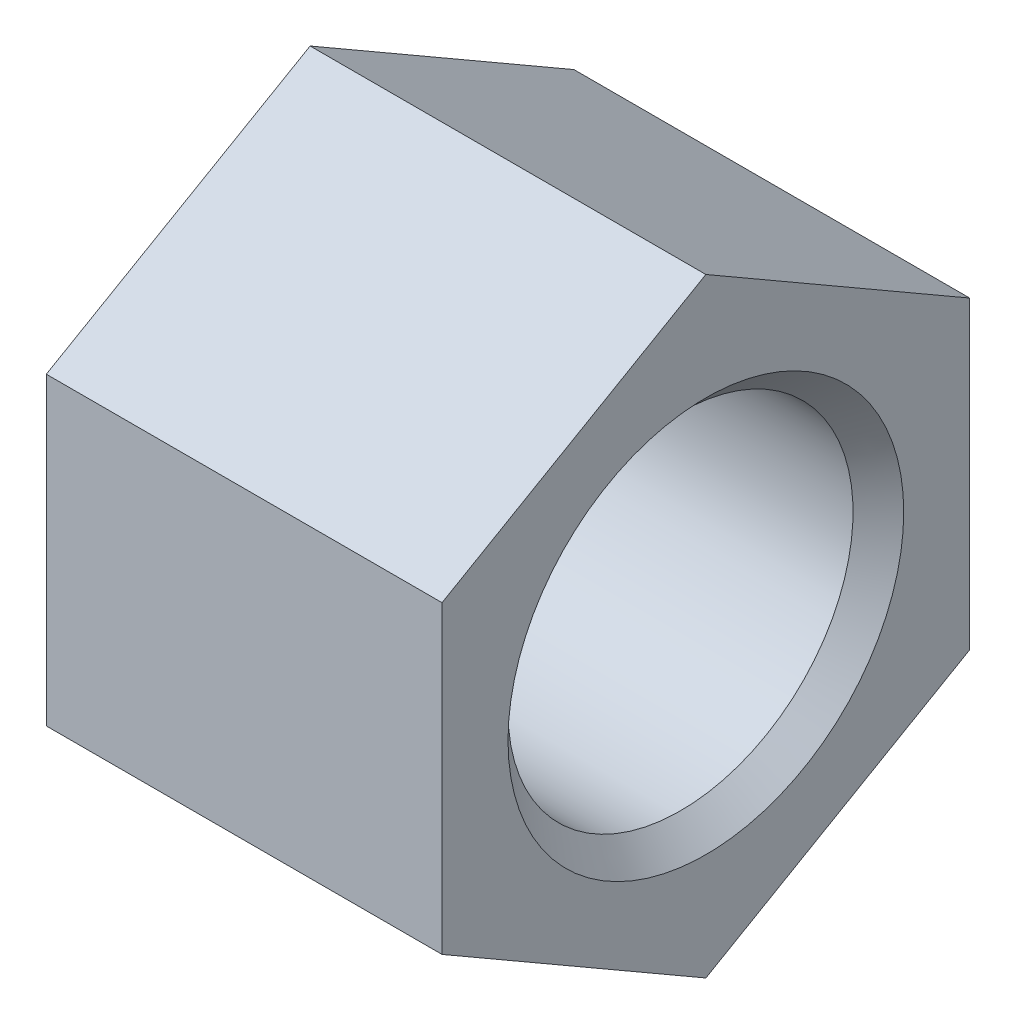
ISO-10303-21;
HEADER;
FILE_DESCRIPTION(('STEP AP214'),'2;1');
FILE_NAME('part.step','',(''),(''),'','','');
FILE_SCHEMA(('AUTOMOTIVE_DESIGN { 1 0 10303 214 1 1 1 1 }'));
ENDSEC;
DATA;
#1=APPLICATION_CONTEXT('core data for automotive mechanical design processes');
#2=APPLICATION_PROTOCOL_DEFINITION('international standard','automotive_design',2000,#1);
#3=PRODUCT_CONTEXT('',#1,'mechanical');
#4=PRODUCT('Part','Part','',(#3));
#5=PRODUCT_RELATED_PRODUCT_CATEGORY('part','',(#4));
#6=PRODUCT_DEFINITION_FORMATION('','',#4);
#7=PRODUCT_DEFINITION_CONTEXT('part definition',#1,'design');
#8=PRODUCT_DEFINITION('design','',#6,#7);
#9=PRODUCT_DEFINITION_SHAPE('','',#8);
#10=(LENGTH_UNIT() NAMED_UNIT(*) SI_UNIT(.MILLI.,.METRE.));
#11=(NAMED_UNIT(*) PLANE_ANGLE_UNIT() SI_UNIT($,.RADIAN.));
#12=(NAMED_UNIT(*) SI_UNIT($,.STERADIAN.) SOLID_ANGLE_UNIT());
#13=UNCERTAINTY_MEASURE_WITH_UNIT(LENGTH_MEASURE(1.E-05),#10,'distance_accuracy_value','');
#14=(GEOMETRIC_REPRESENTATION_CONTEXT(3) GLOBAL_UNCERTAINTY_ASSIGNED_CONTEXT((#13)) GLOBAL_UNIT_ASSIGNED_CONTEXT((#10,
#11,#12)) REPRESENTATION_CONTEXT('',''));
#15=CARTESIAN_POINT('',(0.,0.,0.));
#16=DIRECTION('',(0.,0.,1.));
#17=DIRECTION('',(1.,0.,0.));
#18=AXIS2_PLACEMENT_3D('',#15,#16,#17);
#19=CARTESIAN_POINT('',(0.,19.5,0.));
#20=DIRECTION('',(1.,0.,0.));
#21=DIRECTION('',(0.,0.,-1.));
#22=AXIS2_PLACEMENT_3D('',#19,#20,#21);
#23=PLANE('',#22);
#24=CARTESIAN_POINT('',(0.,0.,0.));
#25=DIRECTION('',(-1.,0.,0.));
#26=DIRECTION('',(0.,0.,1.));
#27=AXIS2_PLACEMENT_3D('',#24,#25,#26);
#28=CIRCLE('',#27,6.5);
#29=CARTESIAN_POINT('',(0.,0.,6.5));
#30=VERTEX_POINT('',#29);
#31=EDGE_CURVE('E156',#30,#30,#28,.T.);
#32=ORIENTED_EDGE('',*,*,#31,.F.);
#33=EDGE_LOOP('',(#32));
#34=FACE_BOUND('',#33,.T.);
#35=DIRECTION('',(0.,-0.5,-0.866025403784439));
#36=VECTOR('',#35,1.);
#37=CARTESIAN_POINT('',(0.,11.5470053837925,-20.));
#38=LINE('',#37,#36);
#39=CARTESIAN_POINT('',(0.,23.094010767585,0.));
#40=VERTEX_POINT('',#39);
#41=CARTESIAN_POINT('',(0.,11.5470053837925,-20.));
#42=VERTEX_POINT('',#41);
#43=EDGE_CURVE('E104',#40,#42,#38,.T.);
#44=ORIENTED_EDGE('',*,*,#43,.T.);
#45=DIRECTION('',(0.,-1.,0.));
#46=VECTOR('',#45,1.);
#47=CARTESIAN_POINT('',(0.,-11.5470053837925,-20.));
#48=LINE('',#47,#46);
#49=CARTESIAN_POINT('',(0.,-11.5470053837925,-20.));
#50=VERTEX_POINT('',#49);
#51=EDGE_CURVE('E218',#42,#50,#48,.T.);
#52=ORIENTED_EDGE('',*,*,#51,.T.);
#53=DIRECTION('',(0.,-0.5,0.866025403784439));
#54=VECTOR('',#53,1.);
#55=CARTESIAN_POINT('',(0.,-23.094010767585,0.));
#56=LINE('',#55,#54);
#57=CARTESIAN_POINT('',(0.,-23.094010767585,0.));
#58=VERTEX_POINT('',#57);
#59=EDGE_CURVE('E220',#50,#58,#56,.T.);
#60=ORIENTED_EDGE('',*,*,#59,.T.);
#61=DIRECTION('',(0.,0.5,0.866025403784439));
#62=VECTOR('',#61,1.);
#63=CARTESIAN_POINT('',(0.,-11.5470053837925,20.));
#64=LINE('',#63,#62);
#65=CARTESIAN_POINT('',(0.,-11.5470053837925,20.));
#66=VERTEX_POINT('',#65);
#67=EDGE_CURVE('E64',#58,#66,#64,.T.);
#68=ORIENTED_EDGE('',*,*,#67,.T.);
#69=DIRECTION('',(0.,1.,0.));
#70=VECTOR('',#69,1.);
#71=CARTESIAN_POINT('',(0.,11.5470053837925,20.));
#72=LINE('',#71,#70);
#73=CARTESIAN_POINT('',(0.,11.5470053837925,20.));
#74=VERTEX_POINT('',#73);
#75=EDGE_CURVE('E135',#66,#74,#72,.T.);
#76=ORIENTED_EDGE('',*,*,#75,.T.);
#77=DIRECTION('',(0.,0.5,-0.866025403784439));
#78=VECTOR('',#77,1.);
#79=CARTESIAN_POINT('',(0.,23.094010767585,0.));
#80=LINE('',#79,#78);
#81=EDGE_CURVE('E147',#74,#40,#80,.T.);
#82=ORIENTED_EDGE('',*,*,#81,.T.);
#83=EDGE_LOOP('',(#44,#52,#60,#68,#76,#82));
#84=FACE_BOUND('',#83,.T.);
#85=ADVANCED_FACE('F48',(#34,#84),#23,.F.);
#86=CARTESIAN_POINT('',(0.,0.,0.));
#87=DIRECTION('',(-1.,0.,0.));
#88=DIRECTION('',(0.,0.,1.));
#89=AXIS2_PLACEMENT_3D('',#86,#87,#88);
#90=CYLINDRICAL_SURFACE('',#89,6.5);
#91=CARTESIAN_POINT('',(5.,0.,0.));
#92=DIRECTION('',(-1.,0.,0.));
#93=DIRECTION('',(0.,0.,1.));
#94=AXIS2_PLACEMENT_3D('',#91,#92,#93);
#95=CIRCLE('',#94,6.5);
#96=CARTESIAN_POINT('',(5.,0.,6.5));
#97=VERTEX_POINT('',#96);
#98=EDGE_CURVE('E153',#97,#97,#95,.T.);
#99=ORIENTED_EDGE('',*,*,#98,.F.);
#100=EDGE_LOOP('',(#99));
#101=FACE_BOUND('',#100,.T.);
#102=ORIENTED_EDGE('',*,*,#31,.T.);
#103=EDGE_LOOP('',(#102));
#104=FACE_BOUND('',#103,.T.);
#105=ADVANCED_FACE('F174',(#101,#104),#90,.F.);
#106=CARTESIAN_POINT('',(5.,6.49999999999999,0.));
#107=DIRECTION('',(-1.,0.,0.));
#108=DIRECTION('',(0.,0.,1.));
#109=AXIS2_PLACEMENT_3D('',#106,#107,#108);
#110=PLANE('',#109);
#111=CARTESIAN_POINT('',(5.,0.,0.));
#112=DIRECTION('',(-1.,0.,0.));
#113=DIRECTION('',(0.,0.,1.));
#114=AXIS2_PLACEMENT_3D('',#111,#112,#113);
#115=CIRCLE('',#114,15.);
#116=CARTESIAN_POINT('',(5.,0.,15.));
#117=VERTEX_POINT('',#116);
#118=EDGE_CURVE('E150',#117,#117,#115,.T.);
#119=ORIENTED_EDGE('',*,*,#118,.F.);
#120=EDGE_LOOP('',(#119));
#121=FACE_BOUND('',#120,.T.);
#122=ORIENTED_EDGE('',*,*,#98,.T.);
#123=EDGE_LOOP('',(#122));
#124=FACE_BOUND('',#123,.T.);
#125=ADVANCED_FACE('F179',(#121,#124),#110,.F.);
#126=CARTESIAN_POINT('',(0.,0.,0.));
#127=DIRECTION('',(-1.,0.,0.));
#128=DIRECTION('',(0.,0.,1.));
#129=AXIS2_PLACEMENT_3D('',#126,#127,#128);
#130=CYLINDRICAL_SURFACE('',#129,15.);
#131=CARTESIAN_POINT('',(9.99999999999999,0.,0.));
#132=DIRECTION('',(-1.,0.,0.));
#133=DIRECTION('',(0.,0.,1.));
#134=AXIS2_PLACEMENT_3D('',#131,#132,#133);
#135=CIRCLE('',#134,15.);
#136=CARTESIAN_POINT('',(9.99999999999999,0.,15.));
#137=VERTEX_POINT('',#136);
#138=EDGE_CURVE('E146',#137,#137,#135,.T.);
#139=ORIENTED_EDGE('',*,*,#138,.F.);
#140=EDGE_LOOP('',(#139));
#141=FACE_BOUND('',#140,.T.);
#142=ORIENTED_EDGE('',*,*,#118,.T.);
#143=EDGE_LOOP('',(#142));
#144=FACE_BOUND('',#143,.T.);
#145=ADVANCED_FACE('F186',(#141,#144),#130,.F.);
#146=CARTESIAN_POINT('',(9.99999999999999,15.,0.));
#147=DIRECTION('',(1.,0.,0.));
#148=DIRECTION('',(0.,0.,-1.));
#149=AXIS2_PLACEMENT_3D('',#146,#147,#148);
#150=PLANE('',#149);
#151=CARTESIAN_POINT('',(9.99999999999999,0.,0.));
#152=DIRECTION('',(-1.,0.,0.));
#153=DIRECTION('',(0.,0.,1.));
#154=AXIS2_PLACEMENT_3D('',#151,#152,#153);
#155=CIRCLE('',#154,13.079);
#156=CARTESIAN_POINT('',(9.99999999999999,0.,13.079));
#157=VERTEX_POINT('',#156);
#158=EDGE_CURVE('E143',#157,#157,#155,.T.);
#159=ORIENTED_EDGE('',*,*,#158,.F.);
#160=EDGE_LOOP('',(#159));
#161=FACE_BOUND('',#160,.T.);
#162=ORIENTED_EDGE('',*,*,#138,.T.);
#163=EDGE_LOOP('',(#162));
#164=FACE_BOUND('',#163,.T.);
#165=ADVANCED_FACE('F190',(#161,#164),#150,.F.);
#166=CARTESIAN_POINT('',(0.,0.,0.));
#167=DIRECTION('',(-1.,0.,0.));
#168=DIRECTION('',(0.,0.,1.));
#169=AXIS2_PLACEMENT_3D('',#166,#167,#168);
#170=CYLINDRICAL_SURFACE('',#169,13.079);
#171=CARTESIAN_POINT('',(28.079,0.,0.));
#172=DIRECTION('',(-1.,0.,0.));
#173=DIRECTION('',(0.,0.,1.));
#174=AXIS2_PLACEMENT_3D('',#171,#172,#173);
#175=CIRCLE('',#174,13.079);
#176=CARTESIAN_POINT('',(28.079,0.,13.079));
#177=VERTEX_POINT('',#176);
#178=EDGE_CURVE('E13',#177,#177,#175,.F.);
#179=ORIENTED_EDGE('',*,*,#178,.T.);
#180=EDGE_LOOP('',(#179));
#181=FACE_BOUND('',#180,.T.);
#182=ORIENTED_EDGE('',*,*,#158,.T.);
#183=EDGE_LOOP('',(#182));
#184=FACE_BOUND('',#183,.T.);
#185=ADVANCED_FACE('F170',(#181,#184),#170,.F.);
#186=CARTESIAN_POINT('',(30.0000000000003,13.079,0.));
#187=DIRECTION('',(-1.,0.,0.));
#188=DIRECTION('',(0.,0.,1.));
#189=AXIS2_PLACEMENT_3D('',#186,#187,#188);
#190=PLANE('',#189);
#191=CARTESIAN_POINT('',(30.,0.,0.));
#192=DIRECTION('',(-1.,0.,0.));
#193=DIRECTION('',(0.,0.,1.));
#194=AXIS2_PLACEMENT_3D('',#191,#192,#193);
#195=CIRCLE('',#194,15.);
#196=CARTESIAN_POINT('',(30.,0.,15.));
#197=VERTEX_POINT('',#196);
#198=EDGE_CURVE('E57',#197,#197,#195,.T.);
#199=ORIENTED_EDGE('',*,*,#198,.T.);
#200=EDGE_LOOP('',(#199));
#201=FACE_BOUND('',#200,.T.);
#202=DIRECTION('',(0.,0.5,0.866025403784439));
#203=VECTOR('',#202,1.);
#204=CARTESIAN_POINT('',(30.0000000000003,11.5470053837925,-20.));
#205=LINE('',#204,#203);
#206=CARTESIAN_POINT('',(30.0000000000003,11.5470053837925,-20.));
#207=VERTEX_POINT('',#206);
#208=CARTESIAN_POINT('',(30.,23.094010767585,0.));
#209=VERTEX_POINT('',#208);
#210=EDGE_CURVE('E102',#207,#209,#205,.T.);
#211=ORIENTED_EDGE('',*,*,#210,.T.);
#212=DIRECTION('',(0.,-0.5,0.866025403784439));
#213=VECTOR('',#212,1.);
#214=CARTESIAN_POINT('',(30.,23.094010767585,0.));
#215=LINE('',#214,#213);
#216=CARTESIAN_POINT('',(30.,11.5470053837925,20.));
#217=VERTEX_POINT('',#216);
#218=EDGE_CURVE('E111',#209,#217,#215,.T.);
#219=ORIENTED_EDGE('',*,*,#218,.T.);
#220=DIRECTION('',(0.,-1.,0.));
#221=VECTOR('',#220,1.);
#222=CARTESIAN_POINT('',(30.,11.5470053837925,20.));
#223=LINE('',#222,#221);
#224=CARTESIAN_POINT('',(30.,-11.5470053837925,20.));
#225=VERTEX_POINT('',#224);
#226=EDGE_CURVE('E117',#217,#225,#223,.T.);
#227=ORIENTED_EDGE('',*,*,#226,.T.);
#228=DIRECTION('',(0.,-0.5,-0.866025403784439));
#229=VECTOR('',#228,1.);
#230=CARTESIAN_POINT('',(30.,-11.5470053837925,20.));
#231=LINE('',#230,#229);
#232=CARTESIAN_POINT('',(30.,-23.094010767585,0.));
#233=VERTEX_POINT('',#232);
#234=EDGE_CURVE('E127',#225,#233,#231,.T.);
#235=ORIENTED_EDGE('',*,*,#234,.T.);
#236=DIRECTION('',(0.,0.5,-0.866025403784439));
#237=VECTOR('',#236,1.);
#238=CARTESIAN_POINT('',(30.,-23.094010767585,0.));
#239=LINE('',#238,#237);
#240=CARTESIAN_POINT('',(30.,-11.5470053837926,-20.0000000000001));
#241=VERTEX_POINT('',#240);
#242=EDGE_CURVE('E130',#233,#241,#239,.T.);
#243=ORIENTED_EDGE('',*,*,#242,.T.);
#244=DIRECTION('',(0.,1.,0.));
#245=VECTOR('',#244,1.);
#246=CARTESIAN_POINT('',(30.,-11.5470053837926,-20.0000000000001));
#247=LINE('',#246,#245);
#248=EDGE_CURVE('E108',#241,#207,#247,.T.);
#249=ORIENTED_EDGE('',*,*,#248,.T.);
#250=EDGE_LOOP('',(#211,#219,#227,#235,#243,#249));
#251=FACE_BOUND('',#250,.T.);
#252=ADVANCED_FACE('F119',(#201,#251),#190,.F.);
#253=CARTESIAN_POINT('',(30.,0.,0.));
#254=DIRECTION('',(1.,0.,0.));
#255=DIRECTION('',(0.,0.,-1.));
#256=AXIS2_PLACEMENT_3D('',#253,#254,#255);
#257=CONICAL_SURFACE('',#256,15.,0.785398163397447);
#258=ORIENTED_EDGE('',*,*,#178,.F.);
#259=EDGE_LOOP('',(#258));
#260=FACE_BOUND('',#259,.T.);
#261=ORIENTED_EDGE('',*,*,#198,.F.);
#262=EDGE_LOOP('',(#261));
#263=FACE_BOUND('',#262,.T.);
#264=ADVANCED_FACE('F50',(#260,#263),#257,.F.);
#265=CARTESIAN_POINT('',(-61.1010092660779,23.094010767585,0.));
#266=DIRECTION('',(0.,0.866025403784439,0.5));
#267=DIRECTION('',(0.,-0.5,0.866025403784439));
#268=AXIS2_PLACEMENT_3D('',#265,#266,#267);
#269=PLANE('',#268);
#270=ORIENTED_EDGE('',*,*,#81,.F.);
#271=DIRECTION('',(1.,0.,0.));
#272=VECTOR('',#271,1.);
#273=CARTESIAN_POINT('',(-61.1010092660779,11.5470053837925,20.));
#274=LINE('',#273,#272);
#275=EDGE_CURVE('E107',#74,#217,#274,.T.);
#276=ORIENTED_EDGE('',*,*,#275,.T.);
#277=ORIENTED_EDGE('',*,*,#218,.F.);
#278=DIRECTION('',(1.,0.,0.));
#279=VECTOR('',#278,1.);
#280=CARTESIAN_POINT('',(-61.1010092660779,23.094010767585,0.));
#281=LINE('',#280,#279);
#282=EDGE_CURVE('E97',#40,#209,#281,.T.);
#283=ORIENTED_EDGE('',*,*,#282,.F.);
#284=EDGE_LOOP('',(#270,#276,#277,#283));
#285=FACE_BOUND('',#284,.T.);
#286=ADVANCED_FACE('F112',(#285),#269,.T.);
#287=CARTESIAN_POINT('',(-61.1010092660779,11.5470053837925,20.));
#288=DIRECTION('',(0.,0.,1.));
#289=DIRECTION('',(1.,0.,0.));
#290=AXIS2_PLACEMENT_3D('',#287,#288,#289);
#291=PLANE('',#290);
#292=ORIENTED_EDGE('',*,*,#75,.F.);
#293=DIRECTION('',(1.,0.,0.));
#294=VECTOR('',#293,1.);
#295=CARTESIAN_POINT('',(-61.1010092660779,-11.5470053837925,20.));
#296=LINE('',#295,#294);
#297=EDGE_CURVE('E140',#66,#225,#296,.T.);
#298=ORIENTED_EDGE('',*,*,#297,.T.);
#299=ORIENTED_EDGE('',*,*,#226,.F.);
#300=ORIENTED_EDGE('',*,*,#275,.F.);
#301=EDGE_LOOP('',(#292,#298,#299,#300));
#302=FACE_BOUND('',#301,.T.);
#303=ADVANCED_FACE('F168',(#302),#291,.T.);
#304=CARTESIAN_POINT('',(-61.1010092660779,-11.5470053837925,20.));
#305=DIRECTION('',(0.,-0.866025403784439,0.5));
#306=DIRECTION('',(0.,-0.5,-0.866025403784439));
#307=AXIS2_PLACEMENT_3D('',#304,#305,#306);
#308=PLANE('',#307);
#309=ORIENTED_EDGE('',*,*,#67,.F.);
#310=DIRECTION('',(1.,0.,0.));
#311=VECTOR('',#310,1.);
#312=CARTESIAN_POINT('',(-61.1010092660779,-23.094010767585,0.));
#313=LINE('',#312,#311);
#314=EDGE_CURVE('E138',#58,#233,#313,.T.);
#315=ORIENTED_EDGE('',*,*,#314,.T.);
#316=ORIENTED_EDGE('',*,*,#234,.F.);
#317=ORIENTED_EDGE('',*,*,#297,.F.);
#318=EDGE_LOOP('',(#309,#315,#316,#317));
#319=FACE_BOUND('',#318,.T.);
#320=ADVANCED_FACE('F203',(#319),#308,.T.);
#321=CARTESIAN_POINT('',(-61.1010092660779,-23.094010767585,0.));
#322=DIRECTION('',(0.,-0.866025403784439,-0.5));
#323=DIRECTION('',(0.,0.5,-0.866025403784439));
#324=AXIS2_PLACEMENT_3D('',#321,#322,#323);
#325=PLANE('',#324);
#326=ORIENTED_EDGE('',*,*,#59,.F.);
#327=DIRECTION('',(1.,0.,0.));
#328=VECTOR('',#327,1.);
#329=CARTESIAN_POINT('',(-61.1010092660779,-11.5470053837925,-20.));
#330=LINE('',#329,#328);
#331=EDGE_CURVE('E136',#50,#241,#330,.T.);
#332=ORIENTED_EDGE('',*,*,#331,.T.);
#333=ORIENTED_EDGE('',*,*,#242,.F.);
#334=ORIENTED_EDGE('',*,*,#314,.F.);
#335=EDGE_LOOP('',(#326,#332,#333,#334));
#336=FACE_BOUND('',#335,.T.);
#337=ADVANCED_FACE('F207',(#336),#325,.T.);
#338=CARTESIAN_POINT('',(-61.1010092660779,-11.5470053837925,-20.));
#339=DIRECTION('',(0.,0.,-1.));
#340=DIRECTION('',(0.,1.,0.));
#341=AXIS2_PLACEMENT_3D('',#338,#339,#340);
#342=PLANE('',#341);
#343=ORIENTED_EDGE('',*,*,#51,.F.);
#344=DIRECTION('',(1.,0.,0.));
#345=VECTOR('',#344,1.);
#346=CARTESIAN_POINT('',(-61.1010092660779,11.5470053837925,-20.));
#347=LINE('',#346,#345);
#348=EDGE_CURVE('E133',#42,#207,#347,.T.);
#349=ORIENTED_EDGE('',*,*,#348,.T.);
#350=ORIENTED_EDGE('',*,*,#248,.F.);
#351=ORIENTED_EDGE('',*,*,#331,.F.);
#352=EDGE_LOOP('',(#343,#349,#350,#351));
#353=FACE_BOUND('',#352,.T.);
#354=ADVANCED_FACE('F199',(#353),#342,.T.);
#355=CARTESIAN_POINT('',(-61.1010092660779,11.5470053837925,-20.));
#356=DIRECTION('',(0.,0.866025403784439,-0.5));
#357=DIRECTION('',(0.,0.5,0.866025403784439));
#358=AXIS2_PLACEMENT_3D('',#355,#356,#357);
#359=PLANE('',#358);
#360=ORIENTED_EDGE('',*,*,#43,.F.);
#361=ORIENTED_EDGE('',*,*,#282,.T.);
#362=ORIENTED_EDGE('',*,*,#210,.F.);
#363=ORIENTED_EDGE('',*,*,#348,.F.);
#364=EDGE_LOOP('',(#360,#361,#362,#363));
#365=FACE_BOUND('',#364,.T.);
#366=ADVANCED_FACE('F99',(#365),#359,.T.);
#367=CLOSED_SHELL('',(#85,#105,#125,#145,#165,#185,#252,#264,#286,#303,#320,#337,#354,#366));
#368=MANIFOLD_SOLID_BREP('B2',#367);
#369=ADVANCED_BREP_SHAPE_REPRESENTATION('',(#18,#368),#14);
#370=SHAPE_DEFINITION_REPRESENTATION(#9,#369);
ENDSEC;
END-ISO-10303-21;
